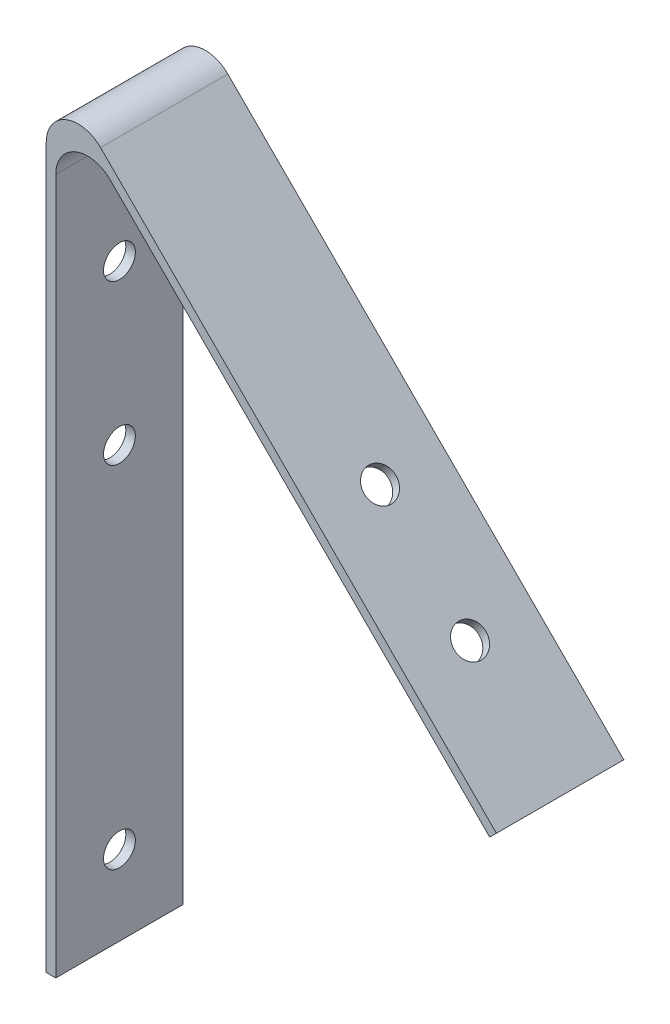
ISO-10303-21;
HEADER;
FILE_DESCRIPTION(('STEP AP214'),'2;1');
FILE_NAME('part.step','',(''),(''),'','','');
FILE_SCHEMA(('AUTOMOTIVE_DESIGN { 1 0 10303 214 1 1 1 1 }'));
ENDSEC;
DATA;
#1=APPLICATION_CONTEXT('core data for automotive mechanical design processes');
#2=APPLICATION_PROTOCOL_DEFINITION('international standard','automotive_design',2000,#1);
#3=PRODUCT_CONTEXT('',#1,'mechanical');
#4=PRODUCT('Part','Part','',(#3));
#5=PRODUCT_RELATED_PRODUCT_CATEGORY('part','',(#4));
#6=PRODUCT_DEFINITION_FORMATION('','',#4);
#7=PRODUCT_DEFINITION_CONTEXT('part definition',#1,'design');
#8=PRODUCT_DEFINITION('design','',#6,#7);
#9=PRODUCT_DEFINITION_SHAPE('','',#8);
#10=(LENGTH_UNIT() NAMED_UNIT(*) SI_UNIT(.MILLI.,.METRE.));
#11=(NAMED_UNIT(*) PLANE_ANGLE_UNIT() SI_UNIT($,.RADIAN.));
#12=(NAMED_UNIT(*) SI_UNIT($,.STERADIAN.) SOLID_ANGLE_UNIT());
#13=UNCERTAINTY_MEASURE_WITH_UNIT(LENGTH_MEASURE(1.E-05),#10,'distance_accuracy_value','');
#14=(GEOMETRIC_REPRESENTATION_CONTEXT(3) GLOBAL_UNCERTAINTY_ASSIGNED_CONTEXT((#13)) GLOBAL_UNIT_ASSIGNED_CONTEXT((#10,
#11,#12)) REPRESENTATION_CONTEXT('',''));
#15=CARTESIAN_POINT('',(0.,0.,0.));
#16=DIRECTION('',(0.,0.,1.));
#17=DIRECTION('',(1.,0.,0.));
#18=AXIS2_PLACEMENT_3D('',#15,#16,#17);
#19=CARTESIAN_POINT('',(3.,0.,40.));
#20=DIRECTION('',(0.,1.,0.));
#21=DIRECTION('',(-1.,0.,0.));
#22=AXIS2_PLACEMENT_3D('',#19,#20,#21);
#23=PLANE('',#22);
#24=DIRECTION('',(1.,0.,0.));
#25=VECTOR('',#24,1.);
#26=CARTESIAN_POINT('',(3.,0.,0.));
#27=LINE('',#26,#25);
#28=CARTESIAN_POINT('',(0.,0.,0.));
#29=VERTEX_POINT('',#28);
#30=CARTESIAN_POINT('',(3.,0.,0.));
#31=VERTEX_POINT('',#30);
#32=EDGE_CURVE('E136',#29,#31,#27,.T.);
#33=ORIENTED_EDGE('',*,*,#32,.T.);
#34=DIRECTION('',(0.,0.,-1.));
#35=VECTOR('',#34,1.);
#36=CARTESIAN_POINT('',(3.,0.,40.));
#37=LINE('',#36,#35);
#38=CARTESIAN_POINT('',(3.,0.,40.));
#39=VERTEX_POINT('',#38);
#40=EDGE_CURVE('E11',#39,#31,#37,.T.);
#41=ORIENTED_EDGE('',*,*,#40,.F.);
#42=DIRECTION('',(1.,0.,0.));
#43=VECTOR('',#42,1.);
#44=CARTESIAN_POINT('',(3.,0.,40.));
#45=LINE('',#44,#43);
#46=CARTESIAN_POINT('',(0.,0.,40.));
#47=VERTEX_POINT('',#46);
#48=EDGE_CURVE('E150',#47,#39,#45,.T.);
#49=ORIENTED_EDGE('',*,*,#48,.F.);
#50=DIRECTION('',(0.,0.,-1.));
#51=VECTOR('',#50,1.);
#52=CARTESIAN_POINT('',(0.,0.,40.));
#53=LINE('',#52,#51);
#54=EDGE_CURVE('E132',#47,#29,#53,.T.);
#55=ORIENTED_EDGE('',*,*,#54,.T.);
#56=EDGE_LOOP('',(#33,#41,#49,#55));
#57=FACE_BOUND('',#56,.T.);
#58=ADVANCED_FACE('F38',(#57),#23,.F.);
#59=CARTESIAN_POINT('',(2.99999999999997,218.61522368915,40.));
#60=DIRECTION('',(-1.,0.,0.));
#61=DIRECTION('',(0.,-1.,0.));
#62=AXIS2_PLACEMENT_3D('',#59,#60,#61);
#63=PLANE('',#62);
#64=CARTESIAN_POINT('',(2.99999999999998,185.,20.));
#65=DIRECTION('',(1.,0.,0.));
#66=DIRECTION('',(0.,1.,0.));
#67=AXIS2_PLACEMENT_3D('',#64,#65,#66);
#68=CIRCLE('',#67,5.);
#69=CARTESIAN_POINT('',(2.99999999999998,190.,20.));
#70=VERTEX_POINT('',#69);
#71=EDGE_CURVE('E165',#70,#70,#68,.T.);
#72=ORIENTED_EDGE('',*,*,#71,.F.);
#73=EDGE_LOOP('',(#72));
#74=FACE_BOUND('',#73,.T.);
#75=CARTESIAN_POINT('',(3.,25.,20.));
#76=DIRECTION('',(1.,0.,0.));
#77=DIRECTION('',(0.,1.,0.));
#78=AXIS2_PLACEMENT_3D('',#75,#76,#77);
#79=CIRCLE('',#78,5.);
#80=CARTESIAN_POINT('',(3.,30.,20.));
#81=VERTEX_POINT('',#80);
#82=EDGE_CURVE('E220',#81,#81,#79,.T.);
#83=ORIENTED_EDGE('',*,*,#82,.F.);
#84=EDGE_LOOP('',(#83));
#85=FACE_BOUND('',#84,.T.);
#86=CARTESIAN_POINT('',(2.99999999999998,135.,20.));
#87=DIRECTION('',(1.,0.,0.));
#88=DIRECTION('',(0.,1.,0.));
#89=AXIS2_PLACEMENT_3D('',#86,#87,#88);
#90=CIRCLE('',#89,5.);
#91=CARTESIAN_POINT('',(2.99999999999998,140.,20.));
#92=VERTEX_POINT('',#91);
#93=EDGE_CURVE('E217',#92,#92,#90,.T.);
#94=ORIENTED_EDGE('',*,*,#93,.F.);
#95=EDGE_LOOP('',(#94));
#96=FACE_BOUND('',#95,.T.);
#97=DIRECTION('',(0.,1.,0.));
#98=VECTOR('',#97,1.);
#99=CARTESIAN_POINT('',(2.99999999999997,218.61522368915,0.));
#100=LINE('',#99,#98);
#101=CARTESIAN_POINT('',(2.99999999999999,218.61522368915,0.));
#102=VERTEX_POINT('',#101);
#103=EDGE_CURVE('E139',#31,#102,#100,.T.);
#104=ORIENTED_EDGE('',*,*,#103,.T.);
#105=DIRECTION('',(0.,0.,-1.));
#106=VECTOR('',#105,1.);
#107=CARTESIAN_POINT('',(2.99999999999999,218.61522368915,40.));
#108=LINE('',#107,#106);
#109=CARTESIAN_POINT('',(2.99999999999999,218.61522368915,40.));
#110=VERTEX_POINT('',#109);
#111=EDGE_CURVE('E47',#110,#102,#108,.T.);
#112=ORIENTED_EDGE('',*,*,#111,.F.);
#113=DIRECTION('',(0.,1.,0.));
#114=VECTOR('',#113,1.);
#115=CARTESIAN_POINT('',(2.99999999999997,218.61522368915,40.));
#116=LINE('',#115,#114);
#117=EDGE_CURVE('E99',#39,#110,#116,.T.);
#118=ORIENTED_EDGE('',*,*,#117,.F.);
#119=ORIENTED_EDGE('',*,*,#40,.T.);
#120=EDGE_LOOP('',(#104,#112,#118,#119));
#121=FACE_BOUND('',#120,.T.);
#122=ADVANCED_FACE('F192',(#74,#85,#96,#121),#63,.F.);
#123=CARTESIAN_POINT('',(13.,218.61522368915,40.));
#124=DIRECTION('',(0.,0.,-1.));
#125=DIRECTION('',(-1.,0.,0.));
#126=AXIS2_PLACEMENT_3D('',#123,#124,#125);
#127=CYLINDRICAL_SURFACE('',#126,9.99999999999998);
#128=CARTESIAN_POINT('',(13.,218.61522368915,0.));
#129=DIRECTION('',(0.,0.,-1.));
#130=DIRECTION('',(1.,0.,0.));
#131=AXIS2_PLACEMENT_3D('',#128,#129,#130);
#132=CIRCLE('',#131,9.99999999999998);
#133=CARTESIAN_POINT('',(20.0710678118655,225.686291501015,0.));
#134=VERTEX_POINT('',#133);
#135=EDGE_CURVE('E141',#102,#134,#132,.T.);
#136=ORIENTED_EDGE('',*,*,#135,.T.);
#137=DIRECTION('',(0.,0.,-1.));
#138=VECTOR('',#137,1.);
#139=CARTESIAN_POINT('',(20.0710678118655,225.686291501015,40.));
#140=LINE('',#139,#138);
#141=CARTESIAN_POINT('',(20.0710678118655,225.686291501015,40.));
#142=VERTEX_POINT('',#141);
#143=EDGE_CURVE('E157',#142,#134,#140,.T.);
#144=ORIENTED_EDGE('',*,*,#143,.F.);
#145=CARTESIAN_POINT('',(13.,218.61522368915,40.));
#146=DIRECTION('',(0.,0.,-1.));
#147=DIRECTION('',(1.,0.,0.));
#148=AXIS2_PLACEMENT_3D('',#145,#146,#147);
#149=CIRCLE('',#148,9.99999999999998);
#150=EDGE_CURVE('E209',#110,#142,#149,.T.);
#151=ORIENTED_EDGE('',*,*,#150,.F.);
#152=ORIENTED_EDGE('',*,*,#111,.T.);
#153=EDGE_LOOP('',(#136,#144,#151,#152));
#154=FACE_BOUND('',#153,.T.);
#155=ADVANCED_FACE('F197',(#154),#127,.F.);
#156=CARTESIAN_POINT('',(139.300035893749,106.45732341913,40.));
#157=DIRECTION('',(0.707106781186551,0.707106781186544,0.));
#158=DIRECTION('',(-0.707106781186544,0.707106781186551,0.));
#159=AXIS2_PLACEMENT_3D('',#156,#157,#158);
#160=PLANE('',#159);
#161=CARTESIAN_POINT('',(82.7314933988257,163.025865914054,20.));
#162=DIRECTION('',(0.707106781186551,0.707106781186544,0.));
#163=DIRECTION('',(-0.707106781186544,0.707106781186551,0.));
#164=AXIS2_PLACEMENT_3D('',#161,#162,#163);
#165=CIRCLE('',#164,5.);
#166=CARTESIAN_POINT('',(79.1959594928929,166.561399819987,20.));
#167=VERTEX_POINT('',#166);
#168=EDGE_CURVE('E221',#167,#167,#165,.T.);
#169=ORIENTED_EDGE('',*,*,#168,.T.);
#170=EDGE_LOOP('',(#169));
#171=FACE_BOUND('',#170,.T.);
#172=CARTESIAN_POINT('',(111.015764646287,134.741594666592,20.));
#173=DIRECTION('',(0.707106781186551,0.707106781186544,0.));
#174=DIRECTION('',(-0.707106781186544,0.707106781186551,0.));
#175=AXIS2_PLACEMENT_3D('',#172,#173,#174);
#176=CIRCLE('',#175,5.);
#177=CARTESIAN_POINT('',(107.480230740355,138.277128572525,20.));
#178=VERTEX_POINT('',#177);
#179=EDGE_CURVE('E227',#178,#178,#176,.T.);
#180=ORIENTED_EDGE('',*,*,#179,.T.);
#181=EDGE_LOOP('',(#180));
#182=FACE_BOUND('',#181,.T.);
#183=DIRECTION('',(0.707106781186544,-0.707106781186551,0.));
#184=VECTOR('',#183,1.);
#185=CARTESIAN_POINT('',(139.300035893749,106.45732341913,0.));
#186=LINE('',#185,#184);
#187=CARTESIAN_POINT('',(139.300035893749,106.45732341913,0.));
#188=VERTEX_POINT('',#187);
#189=EDGE_CURVE('E143',#134,#188,#186,.T.);
#190=ORIENTED_EDGE('',*,*,#189,.T.);
#191=DIRECTION('',(0.,0.,-1.));
#192=VECTOR('',#191,1.);
#193=CARTESIAN_POINT('',(139.300035893749,106.45732341913,40.));
#194=LINE('',#193,#192);
#195=CARTESIAN_POINT('',(139.300035893749,106.45732341913,40.));
#196=VERTEX_POINT('',#195);
#197=EDGE_CURVE('E154',#196,#188,#194,.T.);
#198=ORIENTED_EDGE('',*,*,#197,.F.);
#199=DIRECTION('',(0.707106781186544,-0.707106781186551,0.));
#200=VECTOR('',#199,1.);
#201=CARTESIAN_POINT('',(139.300035893749,106.45732341913,40.));
#202=LINE('',#201,#200);
#203=EDGE_CURVE('E211',#142,#196,#202,.T.);
#204=ORIENTED_EDGE('',*,*,#203,.F.);
#205=ORIENTED_EDGE('',*,*,#143,.T.);
#206=EDGE_LOOP('',(#190,#198,#204,#205));
#207=FACE_BOUND('',#206,.T.);
#208=ADVANCED_FACE('F247',(#171,#182,#207),#160,.F.);
#209=CARTESIAN_POINT('',(141.421356237309,108.57864376269,40.));
#210=DIRECTION('',(-0.707106781186534,0.707106781186561,0.));
#211=DIRECTION('',(-0.707106781186561,-0.707106781186534,0.));
#212=AXIS2_PLACEMENT_3D('',#209,#210,#211);
#213=PLANE('',#212);
#214=DIRECTION('',(0.707106781186561,0.707106781186534,0.));
#215=VECTOR('',#214,1.);
#216=CARTESIAN_POINT('',(141.421356237309,108.57864376269,0.));
#217=LINE('',#216,#215);
#218=CARTESIAN_POINT('',(141.421356237309,108.57864376269,0.));
#219=VERTEX_POINT('',#218);
#220=EDGE_CURVE('E145',#188,#219,#217,.T.);
#221=ORIENTED_EDGE('',*,*,#220,.T.);
#222=DIRECTION('',(0.,0.,-1.));
#223=VECTOR('',#222,1.);
#224=CARTESIAN_POINT('',(141.421356237309,108.57864376269,40.));
#225=LINE('',#224,#223);
#226=CARTESIAN_POINT('',(141.421356237309,108.57864376269,40.));
#227=VERTEX_POINT('',#226);
#228=EDGE_CURVE('E127',#227,#219,#225,.T.);
#229=ORIENTED_EDGE('',*,*,#228,.F.);
#230=DIRECTION('',(0.707106781186561,0.707106781186534,0.));
#231=VECTOR('',#230,1.);
#232=CARTESIAN_POINT('',(141.421356237309,108.57864376269,40.));
#233=LINE('',#232,#231);
#234=EDGE_CURVE('E118',#196,#227,#233,.T.);
#235=ORIENTED_EDGE('',*,*,#234,.F.);
#236=ORIENTED_EDGE('',*,*,#197,.T.);
#237=EDGE_LOOP('',(#221,#229,#235,#236));
#238=FACE_BOUND('',#237,.T.);
#239=ADVANCED_FACE('F241',(#238),#213,.F.);
#240=CARTESIAN_POINT('',(17.0710678118655,232.928932188134,40.));
#241=DIRECTION('',(-0.707106781186551,-0.707106781186544,0.));
#242=DIRECTION('',(0.707106781186544,-0.707106781186551,0.));
#243=AXIS2_PLACEMENT_3D('',#240,#241,#242);
#244=PLANE('',#243);
#245=CARTESIAN_POINT('',(84.8528137423853,165.147186257614,20.));
#246=DIRECTION('',(0.707106781186551,0.707106781186544,0.));
#247=DIRECTION('',(-0.707106781186544,0.707106781186551,0.));
#248=AXIS2_PLACEMENT_3D('',#245,#246,#247);
#249=CIRCLE('',#248,5.);
#250=CARTESIAN_POINT('',(81.3172798364526,168.682720163547,20.));
#251=VERTEX_POINT('',#250);
#252=EDGE_CURVE('E233',#251,#251,#249,.T.);
#253=ORIENTED_EDGE('',*,*,#252,.F.);
#254=EDGE_LOOP('',(#253));
#255=FACE_BOUND('',#254,.T.);
#256=CARTESIAN_POINT('',(113.137084989847,136.862915010152,20.));
#257=DIRECTION('',(0.707106781186551,0.707106781186544,0.));
#258=DIRECTION('',(-0.707106781186544,0.707106781186551,0.));
#259=AXIS2_PLACEMENT_3D('',#256,#257,#258);
#260=CIRCLE('',#259,5.);
#261=CARTESIAN_POINT('',(109.601551083914,140.398448916085,20.));
#262=VERTEX_POINT('',#261);
#263=EDGE_CURVE('E230',#262,#262,#260,.T.);
#264=ORIENTED_EDGE('',*,*,#263,.F.);
#265=EDGE_LOOP('',(#264));
#266=FACE_BOUND('',#265,.T.);
#267=DIRECTION('',(-0.707106781186544,0.707106781186551,0.));
#268=VECTOR('',#267,1.);
#269=CARTESIAN_POINT('',(17.0710678118655,232.928932188134,0.));
#270=LINE('',#269,#268);
#271=CARTESIAN_POINT('',(17.0710678118655,232.928932188134,0.));
#272=VERTEX_POINT('',#271);
#273=EDGE_CURVE('E126',#219,#272,#270,.T.);
#274=ORIENTED_EDGE('',*,*,#273,.T.);
#275=DIRECTION('',(0.,0.,-1.));
#276=VECTOR('',#275,1.);
#277=CARTESIAN_POINT('',(17.0710678118655,232.928932188134,40.));
#278=LINE('',#277,#276);
#279=CARTESIAN_POINT('',(17.0710678118655,232.928932188134,40.));
#280=VERTEX_POINT('',#279);
#281=EDGE_CURVE('E123',#280,#272,#278,.T.);
#282=ORIENTED_EDGE('',*,*,#281,.F.);
#283=DIRECTION('',(-0.707106781186544,0.707106781186551,0.));
#284=VECTOR('',#283,1.);
#285=CARTESIAN_POINT('',(17.0710678118655,232.928932188134,40.));
#286=LINE('',#285,#284);
#287=EDGE_CURVE('E112',#227,#280,#286,.T.);
#288=ORIENTED_EDGE('',*,*,#287,.F.);
#289=ORIENTED_EDGE('',*,*,#228,.T.);
#290=EDGE_LOOP('',(#274,#282,#288,#289));
#291=FACE_BOUND('',#290,.T.);
#292=ADVANCED_FACE('F124',(#255,#266,#291),#244,.F.);
#293=CARTESIAN_POINT('',(10.,225.857864376269,40.));
#294=DIRECTION('',(0.,0.,-1.));
#295=DIRECTION('',(-1.,0.,0.));
#296=AXIS2_PLACEMENT_3D('',#293,#294,#295);
#297=CYLINDRICAL_SURFACE('',#296,9.99999999999999);
#298=CARTESIAN_POINT('',(10.,225.857864376269,0.));
#299=DIRECTION('',(0.,0.,1.));
#300=DIRECTION('',(1.,0.,0.));
#301=AXIS2_PLACEMENT_3D('',#298,#299,#300);
#302=CIRCLE('',#301,9.99999999999999);
#303=CARTESIAN_POINT('',(0.,225.857864376269,0.));
#304=VERTEX_POINT('',#303);
#305=EDGE_CURVE('E85',#272,#304,#302,.T.);
#306=ORIENTED_EDGE('',*,*,#305,.T.);
#307=DIRECTION('',(0.,0.,-1.));
#308=VECTOR('',#307,1.);
#309=CARTESIAN_POINT('',(0.,225.857864376269,40.));
#310=LINE('',#309,#308);
#311=CARTESIAN_POINT('',(0.,225.857864376269,40.));
#312=VERTEX_POINT('',#311);
#313=EDGE_CURVE('E128',#312,#304,#310,.T.);
#314=ORIENTED_EDGE('',*,*,#313,.F.);
#315=CARTESIAN_POINT('',(10.,225.857864376269,40.));
#316=DIRECTION('',(0.,0.,1.));
#317=DIRECTION('',(1.,0.,0.));
#318=AXIS2_PLACEMENT_3D('',#315,#316,#317);
#319=CIRCLE('',#318,9.99999999999999);
#320=EDGE_CURVE('E116',#280,#312,#319,.T.);
#321=ORIENTED_EDGE('',*,*,#320,.F.);
#322=ORIENTED_EDGE('',*,*,#281,.T.);
#323=EDGE_LOOP('',(#306,#314,#321,#322));
#324=FACE_BOUND('',#323,.T.);
#325=ADVANCED_FACE('F130',(#324),#297,.T.);
#326=CARTESIAN_POINT('',(0.,0.,40.));
#327=DIRECTION('',(1.,0.,0.));
#328=DIRECTION('',(0.,0.,-1.));
#329=AXIS2_PLACEMENT_3D('',#326,#327,#328);
#330=PLANE('',#329);
#331=CARTESIAN_POINT('',(0.,185.,20.));
#332=DIRECTION('',(1.,0.,0.));
#333=DIRECTION('',(0.,0.,-1.));
#334=AXIS2_PLACEMENT_3D('',#331,#332,#333);
#335=CIRCLE('',#334,5.);
#336=CARTESIAN_POINT('',(0.,185.,15.));
#337=VERTEX_POINT('',#336);
#338=EDGE_CURVE('E41',#337,#337,#335,.T.);
#339=ORIENTED_EDGE('',*,*,#338,.T.);
#340=EDGE_LOOP('',(#339));
#341=FACE_BOUND('',#340,.T.);
#342=CARTESIAN_POINT('',(0.,25.,20.));
#343=DIRECTION('',(1.,0.,0.));
#344=DIRECTION('',(0.,0.,-1.));
#345=AXIS2_PLACEMENT_3D('',#342,#343,#344);
#346=CIRCLE('',#345,5.);
#347=CARTESIAN_POINT('',(0.,25.,15.));
#348=VERTEX_POINT('',#347);
#349=EDGE_CURVE('E164',#348,#348,#346,.T.);
#350=ORIENTED_EDGE('',*,*,#349,.T.);
#351=EDGE_LOOP('',(#350));
#352=FACE_BOUND('',#351,.T.);
#353=CARTESIAN_POINT('',(0.,135.,20.));
#354=DIRECTION('',(1.,0.,0.));
#355=DIRECTION('',(0.,0.,-1.));
#356=AXIS2_PLACEMENT_3D('',#353,#354,#355);
#357=CIRCLE('',#356,5.);
#358=CARTESIAN_POINT('',(0.,135.,15.));
#359=VERTEX_POINT('',#358);
#360=EDGE_CURVE('E162',#359,#359,#357,.T.);
#361=ORIENTED_EDGE('',*,*,#360,.T.);
#362=EDGE_LOOP('',(#361));
#363=FACE_BOUND('',#362,.T.);
#364=DIRECTION('',(0.,-1.,0.));
#365=VECTOR('',#364,1.);
#366=CARTESIAN_POINT('',(0.,0.,0.));
#367=LINE('',#366,#365);
#368=EDGE_CURVE('E91',#304,#29,#367,.T.);
#369=ORIENTED_EDGE('',*,*,#368,.T.);
#370=ORIENTED_EDGE('',*,*,#54,.F.);
#371=DIRECTION('',(0.,-1.,0.));
#372=VECTOR('',#371,1.);
#373=CARTESIAN_POINT('',(0.,0.,40.));
#374=LINE('',#373,#372);
#375=EDGE_CURVE('E56',#312,#47,#374,.T.);
#376=ORIENTED_EDGE('',*,*,#375,.F.);
#377=ORIENTED_EDGE('',*,*,#313,.T.);
#378=EDGE_LOOP('',(#369,#370,#376,#377));
#379=FACE_BOUND('',#378,.T.);
#380=ADVANCED_FACE('F172',(#341,#352,#363,#379),#330,.F.);
#381=CARTESIAN_POINT('',(10.,225.857864376269,40.));
#382=DIRECTION('',(0.,0.,1.));
#383=DIRECTION('',(1.,0.,0.));
#384=AXIS2_PLACEMENT_3D('',#381,#382,#383);
#385=PLANE('',#384);
#386=ORIENTED_EDGE('',*,*,#48,.T.);
#387=ORIENTED_EDGE('',*,*,#117,.T.);
#388=ORIENTED_EDGE('',*,*,#150,.T.);
#389=ORIENTED_EDGE('',*,*,#203,.T.);
#390=ORIENTED_EDGE('',*,*,#234,.T.);
#391=ORIENTED_EDGE('',*,*,#287,.T.);
#392=ORIENTED_EDGE('',*,*,#320,.T.);
#393=ORIENTED_EDGE('',*,*,#375,.T.);
#394=EDGE_LOOP('',(#386,#387,#388,#389,#390,#391,#392,#393));
#395=FACE_BOUND('',#394,.T.);
#396=ADVANCED_FACE('F114',(#395),#385,.T.);
#397=CARTESIAN_POINT('',(10.,225.857864376269,0.));
#398=DIRECTION('',(0.,0.,1.));
#399=DIRECTION('',(1.,0.,0.));
#400=AXIS2_PLACEMENT_3D('',#397,#398,#399);
#401=PLANE('',#400);
#402=ORIENTED_EDGE('',*,*,#32,.F.);
#403=ORIENTED_EDGE('',*,*,#368,.F.);
#404=ORIENTED_EDGE('',*,*,#305,.F.);
#405=ORIENTED_EDGE('',*,*,#273,.F.);
#406=ORIENTED_EDGE('',*,*,#220,.F.);
#407=ORIENTED_EDGE('',*,*,#189,.F.);
#408=ORIENTED_EDGE('',*,*,#135,.F.);
#409=ORIENTED_EDGE('',*,*,#103,.F.);
#410=EDGE_LOOP('',(#402,#403,#404,#405,#406,#407,#408,#409));
#411=FACE_BOUND('',#410,.T.);
#412=ADVANCED_FACE('F203',(#411),#401,.F.);
#413=CARTESIAN_POINT('',(-37.,135.,20.));
#414=DIRECTION('',(1.,0.,0.));
#415=DIRECTION('',(0.,1.,0.));
#416=AXIS2_PLACEMENT_3D('',#413,#414,#415);
#417=CYLINDRICAL_SURFACE('',#416,5.);
#418=ORIENTED_EDGE('',*,*,#93,.T.);
#419=EDGE_LOOP('',(#418));
#420=FACE_BOUND('',#419,.T.);
#421=ORIENTED_EDGE('',*,*,#360,.F.);
#422=EDGE_LOOP('',(#421));
#423=FACE_BOUND('',#422,.T.);
#424=ADVANCED_FACE('F187',(#420,#423),#417,.F.);
#425=CARTESIAN_POINT('',(-37.,25.,20.));
#426=DIRECTION('',(1.,0.,0.));
#427=DIRECTION('',(0.,1.,0.));
#428=AXIS2_PLACEMENT_3D('',#425,#426,#427);
#429=CYLINDRICAL_SURFACE('',#428,5.);
#430=ORIENTED_EDGE('',*,*,#82,.T.);
#431=EDGE_LOOP('',(#430));
#432=FACE_BOUND('',#431,.T.);
#433=ORIENTED_EDGE('',*,*,#349,.F.);
#434=EDGE_LOOP('',(#433));
#435=FACE_BOUND('',#434,.T.);
#436=ADVANCED_FACE('F177',(#432,#435),#429,.F.);
#437=CARTESIAN_POINT('',(-37.,185.,20.));
#438=DIRECTION('',(1.,0.,0.));
#439=DIRECTION('',(0.,1.,0.));
#440=AXIS2_PLACEMENT_3D('',#437,#438,#439);
#441=CYLINDRICAL_SURFACE('',#440,5.);
#442=ORIENTED_EDGE('',*,*,#71,.T.);
#443=EDGE_LOOP('',(#442));
#444=FACE_BOUND('',#443,.T.);
#445=ORIENTED_EDGE('',*,*,#338,.F.);
#446=EDGE_LOOP('',(#445));
#447=FACE_BOUND('',#446,.T.);
#448=ADVANCED_FACE('F174',(#444,#447),#441,.F.);
#449=CARTESIAN_POINT('',(84.852813742385,108.57864376269,20.));
#450=DIRECTION('',(0.707106781186551,0.707106781186544,0.));
#451=DIRECTION('',(-0.707106781186544,0.707106781186551,0.));
#452=AXIS2_PLACEMENT_3D('',#449,#450,#451);
#453=CYLINDRICAL_SURFACE('',#452,5.);
#454=ORIENTED_EDGE('',*,*,#263,.T.);
#455=EDGE_LOOP('',(#454));
#456=FACE_BOUND('',#455,.T.);
#457=ORIENTED_EDGE('',*,*,#179,.F.);
#458=EDGE_LOOP('',(#457));
#459=FACE_BOUND('',#458,.T.);
#460=ADVANCED_FACE('F176',(#456,#459),#453,.F.);
#461=CARTESIAN_POINT('',(56.5685424949233,136.862915010152,20.));
#462=DIRECTION('',(0.707106781186551,0.707106781186544,0.));
#463=DIRECTION('',(-0.707106781186544,0.707106781186551,0.));
#464=AXIS2_PLACEMENT_3D('',#461,#462,#463);
#465=CYLINDRICAL_SURFACE('',#464,5.);
#466=ORIENTED_EDGE('',*,*,#252,.T.);
#467=EDGE_LOOP('',(#466));
#468=FACE_BOUND('',#467,.T.);
#469=ORIENTED_EDGE('',*,*,#168,.F.);
#470=EDGE_LOOP('',(#469));
#471=FACE_BOUND('',#470,.T.);
#472=ADVANCED_FACE('F184',(#468,#471),#465,.F.);
#473=CLOSED_SHELL('',(#58,#122,#155,#208,#239,#292,#325,#380,#396,#412,#424,#436,#448,#460,#472));
#474=MANIFOLD_SOLID_BREP('B2',#473);
#475=ADVANCED_BREP_SHAPE_REPRESENTATION('',(#18,#474),#14);
#476=SHAPE_DEFINITION_REPRESENTATION(#9,#475);
ENDSEC;
END-ISO-10303-21;
